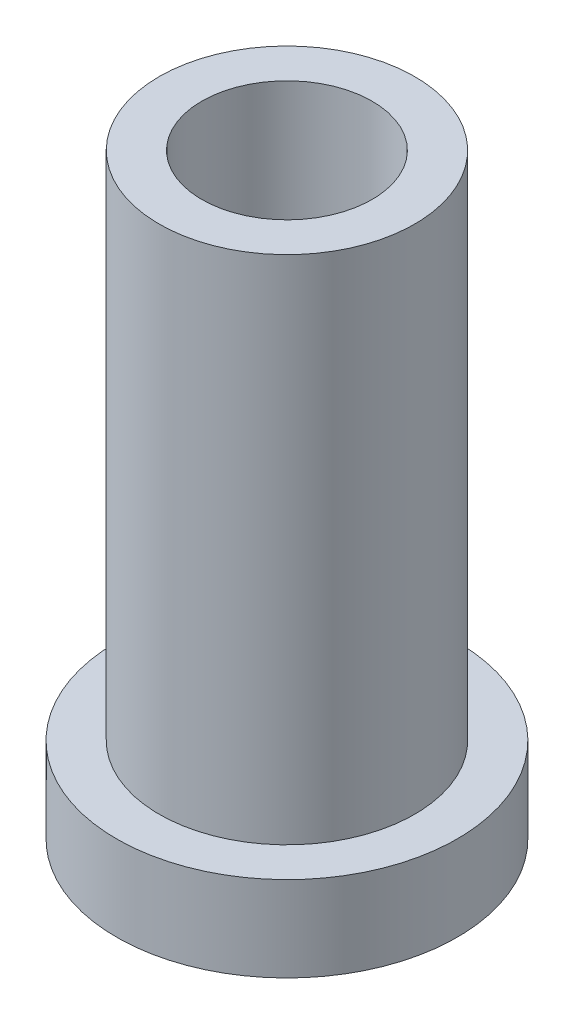
ISO-10303-21;
HEADER;
FILE_DESCRIPTION(('STEP AP214'),'2;1');
FILE_NAME('part.step','',(''),(''),'','','');
FILE_SCHEMA(('AUTOMOTIVE_DESIGN { 1 0 10303 214 1 1 1 1 }'));
ENDSEC;
DATA;
#1=APPLICATION_CONTEXT('core data for automotive mechanical design processes');
#2=APPLICATION_PROTOCOL_DEFINITION('international standard','automotive_design',2000,#1);
#3=PRODUCT_CONTEXT('',#1,'mechanical');
#4=PRODUCT('Part','Part','',(#3));
#5=PRODUCT_RELATED_PRODUCT_CATEGORY('part','',(#4));
#6=PRODUCT_DEFINITION_FORMATION('','',#4);
#7=PRODUCT_DEFINITION_CONTEXT('part definition',#1,'design');
#8=PRODUCT_DEFINITION('design','',#6,#7);
#9=PRODUCT_DEFINITION_SHAPE('','',#8);
#10=(LENGTH_UNIT() NAMED_UNIT(*) SI_UNIT(.MILLI.,.METRE.));
#11=(NAMED_UNIT(*) PLANE_ANGLE_UNIT() SI_UNIT($,.RADIAN.));
#12=(NAMED_UNIT(*) SI_UNIT($,.STERADIAN.) SOLID_ANGLE_UNIT());
#13=UNCERTAINTY_MEASURE_WITH_UNIT(LENGTH_MEASURE(1.E-05),#10,'distance_accuracy_value','');
#14=(GEOMETRIC_REPRESENTATION_CONTEXT(3) GLOBAL_UNCERTAINTY_ASSIGNED_CONTEXT((#13)) GLOBAL_UNIT_ASSIGNED_CONTEXT((#10,
#11,#12)) REPRESENTATION_CONTEXT('',''));
#15=CARTESIAN_POINT('',(0.,0.,0.));
#16=DIRECTION('',(0.,0.,1.));
#17=DIRECTION('',(1.,0.,0.));
#18=AXIS2_PLACEMENT_3D('',#15,#16,#17);
#19=CARTESIAN_POINT('',(0.,0.,0.));
#20=DIRECTION('',(0.,1.,0.));
#21=DIRECTION('',(-1.,0.,0.));
#22=AXIS2_PLACEMENT_3D('',#19,#20,#21);
#23=PLANE('',#22);
#24=CARTESIAN_POINT('',(0.,0.,0.));
#25=DIRECTION('',(0.,1.,0.));
#26=DIRECTION('',(-1.,0.,0.));
#27=AXIS2_PLACEMENT_3D('',#24,#25,#26);
#28=CIRCLE('',#27,5.);
#29=CARTESIAN_POINT('',(-5.,0.,0.));
#30=VERTEX_POINT('',#29);
#31=EDGE_CURVE('E57',#30,#30,#28,.T.);
#32=ORIENTED_EDGE('',*,*,#31,.T.);
#33=EDGE_LOOP('',(#32));
#34=FACE_BOUND('',#33,.T.);
#35=CARTESIAN_POINT('',(0.,0.,0.));
#36=DIRECTION('',(0.,1.,0.));
#37=DIRECTION('',(-1.,0.,0.));
#38=AXIS2_PLACEMENT_3D('',#35,#36,#37);
#39=CIRCLE('',#38,10.);
#40=CARTESIAN_POINT('',(-9.99999999999999,0.,0.));
#41=VERTEX_POINT('',#40);
#42=EDGE_CURVE('E10',#41,#41,#39,.T.);
#43=ORIENTED_EDGE('',*,*,#42,.F.);
#44=EDGE_LOOP('',(#43));
#45=FACE_BOUND('',#44,.T.);
#46=ADVANCED_FACE('F38',(#34,#45),#23,.F.);
#47=CARTESIAN_POINT('',(0.,40.,0.));
#48=DIRECTION('',(0.,1.,0.));
#49=DIRECTION('',(-1.,0.,0.));
#50=AXIS2_PLACEMENT_3D('',#47,#48,#49);
#51=CYLINDRICAL_SURFACE('',#50,10.);
#52=CARTESIAN_POINT('',(0.,5.,0.));
#53=DIRECTION('',(0.,1.,0.));
#54=DIRECTION('',(-1.,0.,0.));
#55=AXIS2_PLACEMENT_3D('',#52,#53,#54);
#56=CIRCLE('',#55,10.);
#57=CARTESIAN_POINT('',(-9.99999999999999,5.,0.));
#58=VERTEX_POINT('',#57);
#59=EDGE_CURVE('E44',#58,#58,#56,.T.);
#60=ORIENTED_EDGE('',*,*,#59,.F.);
#61=EDGE_LOOP('',(#60));
#62=FACE_BOUND('',#61,.T.);
#63=ORIENTED_EDGE('',*,*,#42,.T.);
#64=EDGE_LOOP('',(#63));
#65=FACE_BOUND('',#64,.T.);
#66=ADVANCED_FACE('F86',(#62,#65),#51,.T.);
#67=CARTESIAN_POINT('',(10.,5.,0.));
#68=DIRECTION('',(0.,-1.,0.));
#69=DIRECTION('',(1.,0.,0.));
#70=AXIS2_PLACEMENT_3D('',#67,#68,#69);
#71=PLANE('',#70);
#72=CARTESIAN_POINT('',(0.,5.,0.));
#73=DIRECTION('',(0.,1.,0.));
#74=DIRECTION('',(-1.,0.,0.));
#75=AXIS2_PLACEMENT_3D('',#72,#73,#74);
#76=CIRCLE('',#75,7.5);
#77=CARTESIAN_POINT('',(-7.49999999999999,5.,0.));
#78=VERTEX_POINT('',#77);
#79=EDGE_CURVE('E48',#78,#78,#76,.T.);
#80=ORIENTED_EDGE('',*,*,#79,.F.);
#81=EDGE_LOOP('',(#80));
#82=FACE_BOUND('',#81,.T.);
#83=ORIENTED_EDGE('',*,*,#59,.T.);
#84=EDGE_LOOP('',(#83));
#85=FACE_BOUND('',#84,.T.);
#86=ADVANCED_FACE('F81',(#82,#85),#71,.F.);
#87=CARTESIAN_POINT('',(0.,40.,0.));
#88=DIRECTION('',(0.,1.,0.));
#89=DIRECTION('',(-1.,0.,0.));
#90=AXIS2_PLACEMENT_3D('',#87,#88,#89);
#91=CYLINDRICAL_SURFACE('',#90,7.5);
#92=CARTESIAN_POINT('',(0.,35.,0.));
#93=DIRECTION('',(0.,1.,0.));
#94=DIRECTION('',(-1.,0.,0.));
#95=AXIS2_PLACEMENT_3D('',#92,#93,#94);
#96=CIRCLE('',#95,7.5);
#97=CARTESIAN_POINT('',(-7.5,35.,0.));
#98=VERTEX_POINT('',#97);
#99=EDGE_CURVE('E52',#98,#98,#96,.T.);
#100=ORIENTED_EDGE('',*,*,#99,.F.);
#101=EDGE_LOOP('',(#100));
#102=FACE_BOUND('',#101,.T.);
#103=ORIENTED_EDGE('',*,*,#79,.T.);
#104=EDGE_LOOP('',(#103));
#105=FACE_BOUND('',#104,.T.);
#106=ADVANCED_FACE('F75',(#102,#105),#91,.T.);
#107=CARTESIAN_POINT('',(7.50000000000001,35.,0.));
#108=DIRECTION('',(0.,-1.,0.));
#109=DIRECTION('',(1.,0.,0.));
#110=AXIS2_PLACEMENT_3D('',#107,#108,#109);
#111=PLANE('',#110);
#112=CARTESIAN_POINT('',(0.,35.,0.));
#113=DIRECTION('',(0.,1.,0.));
#114=DIRECTION('',(-1.,0.,0.));
#115=AXIS2_PLACEMENT_3D('',#112,#113,#114);
#116=CIRCLE('',#115,5.);
#117=CARTESIAN_POINT('',(-5.,35.,0.));
#118=VERTEX_POINT('',#117);
#119=EDGE_CURVE('E58',#118,#118,#116,.T.);
#120=ORIENTED_EDGE('',*,*,#119,.F.);
#121=EDGE_LOOP('',(#120));
#122=FACE_BOUND('',#121,.T.);
#123=ORIENTED_EDGE('',*,*,#99,.T.);
#124=EDGE_LOOP('',(#123));
#125=FACE_BOUND('',#124,.T.);
#126=ADVANCED_FACE('F69',(#122,#125),#111,.F.);
#127=CARTESIAN_POINT('',(0.,0.,0.));
#128=DIRECTION('',(0.,1.,0.));
#129=DIRECTION('',(-1.,0.,0.));
#130=AXIS2_PLACEMENT_3D('',#127,#128,#129);
#131=CYLINDRICAL_SURFACE('',#130,5.);
#132=ORIENTED_EDGE('',*,*,#31,.F.);
#133=EDGE_LOOP('',(#132));
#134=FACE_BOUND('',#133,.T.);
#135=ORIENTED_EDGE('',*,*,#119,.T.);
#136=EDGE_LOOP('',(#135));
#137=FACE_BOUND('',#136,.T.);
#138=ADVANCED_FACE('F66',(#134,#137),#131,.F.);
#139=CLOSED_SHELL('',(#46,#66,#86,#106,#126,#138));
#140=MANIFOLD_SOLID_BREP('B2',#139);
#141=ADVANCED_BREP_SHAPE_REPRESENTATION('',(#18,#140),#14);
#142=SHAPE_DEFINITION_REPRESENTATION(#9,#141);
ENDSEC;
END-ISO-10303-21;
